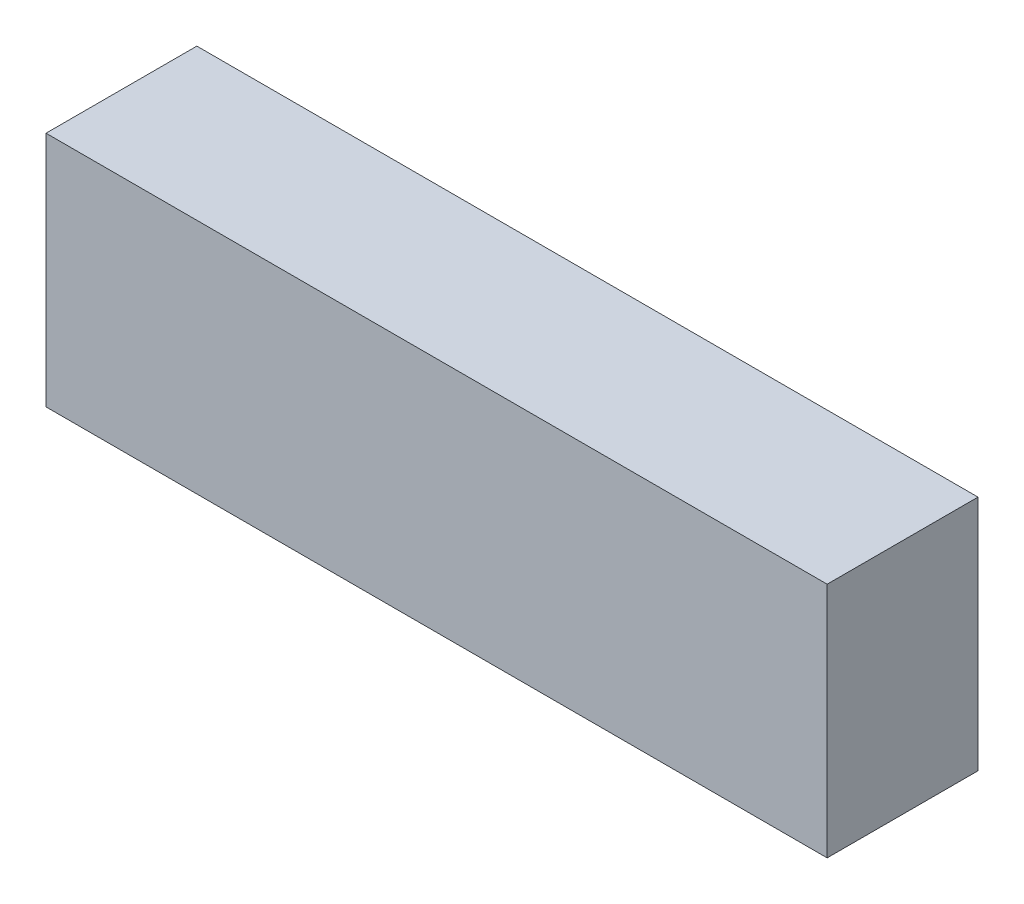
ISO-10303-21;
HEADER;
FILE_DESCRIPTION(('STEP AP214'),'2;1');
FILE_NAME('part.step','',(''),(''),'','','');
FILE_SCHEMA(('AUTOMOTIVE_DESIGN { 1 0 10303 214 1 1 1 1 }'));
ENDSEC;
DATA;
#1=APPLICATION_CONTEXT('core data for automotive mechanical design processes');
#2=APPLICATION_PROTOCOL_DEFINITION('international standard','automotive_design',2000,#1);
#3=PRODUCT_CONTEXT('',#1,'mechanical');
#4=PRODUCT('Part','Part','',(#3));
#5=PRODUCT_RELATED_PRODUCT_CATEGORY('part','',(#4));
#6=PRODUCT_DEFINITION_FORMATION('','',#4);
#7=PRODUCT_DEFINITION_CONTEXT('part definition',#1,'design');
#8=PRODUCT_DEFINITION('design','',#6,#7);
#9=PRODUCT_DEFINITION_SHAPE('','',#8);
#10=(LENGTH_UNIT() NAMED_UNIT(*) SI_UNIT(.MILLI.,.METRE.));
#11=(NAMED_UNIT(*) PLANE_ANGLE_UNIT() SI_UNIT($,.RADIAN.));
#12=(NAMED_UNIT(*) SI_UNIT($,.STERADIAN.) SOLID_ANGLE_UNIT());
#13=UNCERTAINTY_MEASURE_WITH_UNIT(LENGTH_MEASURE(1.E-05),#10,'distance_accuracy_value','');
#14=(GEOMETRIC_REPRESENTATION_CONTEXT(3) GLOBAL_UNCERTAINTY_ASSIGNED_CONTEXT((#13)) GLOBAL_UNIT_ASSIGNED_CONTEXT((#10,
#11,#12)) REPRESENTATION_CONTEXT('',''));
#15=CARTESIAN_POINT('',(0.,0.,0.));
#16=DIRECTION('',(0.,0.,1.));
#17=DIRECTION('',(1.,0.,0.));
#18=AXIS2_PLACEMENT_3D('',#15,#16,#17);
#19=CARTESIAN_POINT('',(-72.5,-22.,28.));
#20=DIRECTION('',(1.,0.,0.));
#21=DIRECTION('',(0.,1.,0.));
#22=AXIS2_PLACEMENT_3D('',#19,#20,#21);
#23=PLANE('',#22);
#24=DIRECTION('',(0.,-1.,0.));
#25=VECTOR('',#24,1.);
#26=CARTESIAN_POINT('',(-72.5,-22.,0.));
#27=LINE('',#26,#25);
#28=CARTESIAN_POINT('',(-72.5,22.,0.));
#29=VERTEX_POINT('',#28);
#30=CARTESIAN_POINT('',(-72.5,-22.,0.));
#31=VERTEX_POINT('',#30);
#32=EDGE_CURVE('E11',#29,#31,#27,.T.);
#33=ORIENTED_EDGE('',*,*,#32,.T.);
#34=DIRECTION('',(0.,0.,-1.));
#35=VECTOR('',#34,1.);
#36=CARTESIAN_POINT('',(-72.5,-22.,28.));
#37=LINE('',#36,#35);
#38=CARTESIAN_POINT('',(-72.5,-22.,28.));
#39=VERTEX_POINT('',#38);
#40=EDGE_CURVE('E42',#39,#31,#37,.T.);
#41=ORIENTED_EDGE('',*,*,#40,.F.);
#42=DIRECTION('',(0.,-1.,0.));
#43=VECTOR('',#42,1.);
#44=CARTESIAN_POINT('',(-72.5,-22.,28.));
#45=LINE('',#44,#43);
#46=CARTESIAN_POINT('',(-72.5,22.,28.));
#47=VERTEX_POINT('',#46);
#48=EDGE_CURVE('E91',#47,#39,#45,.T.);
#49=ORIENTED_EDGE('',*,*,#48,.F.);
#50=DIRECTION('',(0.,0.,-1.));
#51=VECTOR('',#50,1.);
#52=CARTESIAN_POINT('',(-72.5,22.,28.));
#53=LINE('',#52,#51);
#54=EDGE_CURVE('E28',#47,#29,#53,.T.);
#55=ORIENTED_EDGE('',*,*,#54,.T.);
#56=EDGE_LOOP('',(#33,#41,#49,#55));
#57=FACE_BOUND('',#56,.T.);
#58=ADVANCED_FACE('F18',(#57),#23,.F.);
#59=CARTESIAN_POINT('',(72.5,-22.,28.));
#60=DIRECTION('',(0.,1.,0.));
#61=DIRECTION('',(1.,0.,0.));
#62=AXIS2_PLACEMENT_3D('',#59,#60,#61);
#63=PLANE('',#62);
#64=DIRECTION('',(1.,0.,0.));
#65=VECTOR('',#64,1.);
#66=CARTESIAN_POINT('',(72.5,-22.,0.));
#67=LINE('',#66,#65);
#68=CARTESIAN_POINT('',(72.5,-22.,0.));
#69=VERTEX_POINT('',#68);
#70=EDGE_CURVE('E108',#31,#69,#67,.T.);
#71=ORIENTED_EDGE('',*,*,#70,.T.);
#72=DIRECTION('',(0.,0.,-1.));
#73=VECTOR('',#72,1.);
#74=CARTESIAN_POINT('',(72.5,-22.,28.));
#75=LINE('',#74,#73);
#76=CARTESIAN_POINT('',(72.5,-22.,28.));
#77=VERTEX_POINT('',#76);
#78=EDGE_CURVE('E104',#77,#69,#75,.T.);
#79=ORIENTED_EDGE('',*,*,#78,.F.);
#80=DIRECTION('',(1.,0.,0.));
#81=VECTOR('',#80,1.);
#82=CARTESIAN_POINT('',(72.5,-22.,28.));
#83=LINE('',#82,#81);
#84=EDGE_CURVE('E76',#39,#77,#83,.T.);
#85=ORIENTED_EDGE('',*,*,#84,.F.);
#86=ORIENTED_EDGE('',*,*,#40,.T.);
#87=EDGE_LOOP('',(#71,#79,#85,#86));
#88=FACE_BOUND('',#87,.T.);
#89=ADVANCED_FACE('F120',(#88),#63,.F.);
#90=CARTESIAN_POINT('',(72.5,-22.,28.));
#91=DIRECTION('',(-1.,0.,0.));
#92=DIRECTION('',(0.,0.,1.));
#93=AXIS2_PLACEMENT_3D('',#90,#91,#92);
#94=PLANE('',#93);
#95=DIRECTION('',(0.,1.,0.));
#96=VECTOR('',#95,1.);
#97=CARTESIAN_POINT('',(72.5,-22.,0.));
#98=LINE('',#97,#96);
#99=CARTESIAN_POINT('',(72.5,22.,0.));
#100=VERTEX_POINT('',#99);
#101=EDGE_CURVE('E21',#69,#100,#98,.T.);
#102=ORIENTED_EDGE('',*,*,#101,.T.);
#103=DIRECTION('',(0.,0.,-1.));
#104=VECTOR('',#103,1.);
#105=CARTESIAN_POINT('',(72.5,22.,28.));
#106=LINE('',#105,#104);
#107=CARTESIAN_POINT('',(72.5,22.,28.));
#108=VERTEX_POINT('',#107);
#109=EDGE_CURVE('E83',#108,#100,#106,.T.);
#110=ORIENTED_EDGE('',*,*,#109,.F.);
#111=DIRECTION('',(0.,1.,0.));
#112=VECTOR('',#111,1.);
#113=CARTESIAN_POINT('',(72.5,-22.,28.));
#114=LINE('',#113,#112);
#115=EDGE_CURVE('E71',#77,#108,#114,.T.);
#116=ORIENTED_EDGE('',*,*,#115,.F.);
#117=ORIENTED_EDGE('',*,*,#78,.T.);
#118=EDGE_LOOP('',(#102,#110,#116,#117));
#119=FACE_BOUND('',#118,.T.);
#120=ADVANCED_FACE('F84',(#119),#94,.F.);
#121=CARTESIAN_POINT('',(72.5,22.,28.));
#122=DIRECTION('',(0.,-1.,0.));
#123=DIRECTION('',(0.,0.,-1.));
#124=AXIS2_PLACEMENT_3D('',#121,#122,#123);
#125=PLANE('',#124);
#126=DIRECTION('',(-1.,0.,0.));
#127=VECTOR('',#126,1.);
#128=CARTESIAN_POINT('',(72.5,22.,0.));
#129=LINE('',#128,#127);
#130=EDGE_CURVE('E90',#100,#29,#129,.T.);
#131=ORIENTED_EDGE('',*,*,#130,.T.);
#132=ORIENTED_EDGE('',*,*,#54,.F.);
#133=DIRECTION('',(-1.,0.,0.));
#134=VECTOR('',#133,1.);
#135=CARTESIAN_POINT('',(72.5,22.,28.));
#136=LINE('',#135,#134);
#137=EDGE_CURVE('E75',#108,#47,#136,.T.);
#138=ORIENTED_EDGE('',*,*,#137,.F.);
#139=ORIENTED_EDGE('',*,*,#109,.T.);
#140=EDGE_LOOP('',(#131,#132,#138,#139));
#141=FACE_BOUND('',#140,.T.);
#142=ADVANCED_FACE('F94',(#141),#125,.F.);
#143=CARTESIAN_POINT('',(0.,0.,28.));
#144=DIRECTION('',(0.,0.,1.));
#145=DIRECTION('',(1.,0.,0.));
#146=AXIS2_PLACEMENT_3D('',#143,#144,#145);
#147=PLANE('',#146);
#148=ORIENTED_EDGE('',*,*,#48,.T.);
#149=ORIENTED_EDGE('',*,*,#84,.T.);
#150=ORIENTED_EDGE('',*,*,#115,.T.);
#151=ORIENTED_EDGE('',*,*,#137,.T.);
#152=EDGE_LOOP('',(#148,#149,#150,#151));
#153=FACE_BOUND('',#152,.T.);
#154=ADVANCED_FACE('F73',(#153),#147,.T.);
#155=CARTESIAN_POINT('',(0.,0.,0.));
#156=DIRECTION('',(0.,0.,1.));
#157=DIRECTION('',(1.,0.,0.));
#158=AXIS2_PLACEMENT_3D('',#155,#156,#157);
#159=PLANE('',#158);
#160=ORIENTED_EDGE('',*,*,#32,.F.);
#161=ORIENTED_EDGE('',*,*,#130,.F.);
#162=ORIENTED_EDGE('',*,*,#101,.F.);
#163=ORIENTED_EDGE('',*,*,#70,.F.);
#164=EDGE_LOOP('',(#160,#161,#162,#163));
#165=FACE_BOUND('',#164,.T.);
#166=ADVANCED_FACE('F186',(#165),#159,.F.);
#167=CLOSED_SHELL('',(#58,#89,#120,#142,#154,#166));
#168=MANIFOLD_SOLID_BREP('B1',#167);
#169=ADVANCED_BREP_SHAPE_REPRESENTATION('',(#18,#168),#14);
#170=SHAPE_DEFINITION_REPRESENTATION(#9,#169);
ENDSEC;
END-ISO-10303-21;
